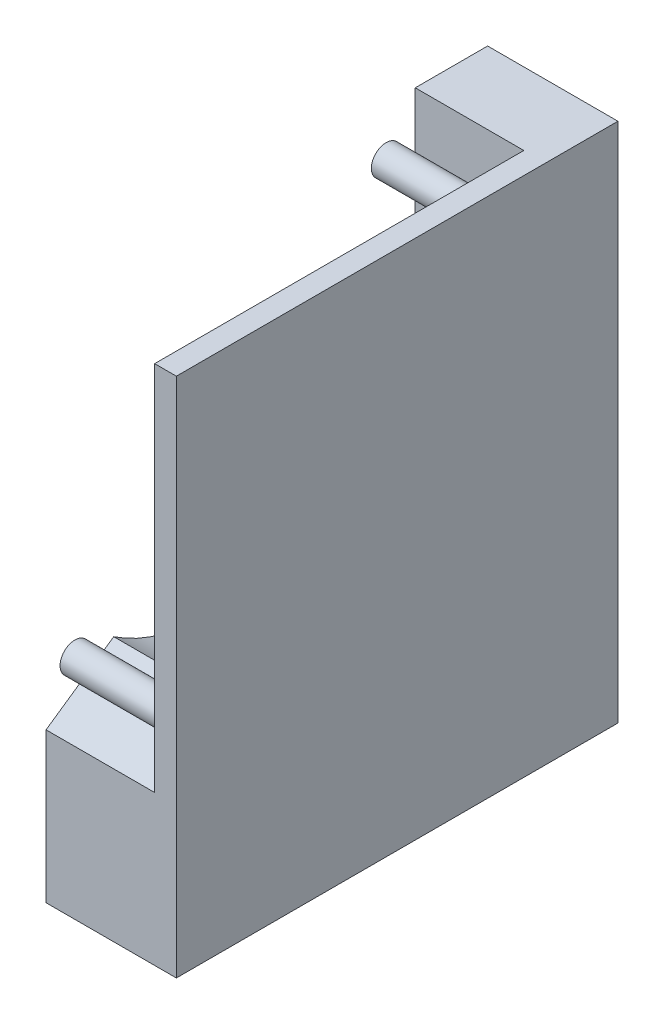
ISO-10303-21;
HEADER;
FILE_DESCRIPTION(('STEP AP214'),'2;1');
FILE_NAME('part.step','',(''),(''),'','','');
FILE_SCHEMA(('AUTOMOTIVE_DESIGN { 1 0 10303 214 1 1 1 1 }'));
ENDSEC;
DATA;
#1=APPLICATION_CONTEXT('core data for automotive mechanical design processes');
#2=APPLICATION_PROTOCOL_DEFINITION('international standard','automotive_design',2000,#1);
#3=PRODUCT_CONTEXT('',#1,'mechanical');
#4=PRODUCT('Part','Part','',(#3));
#5=PRODUCT_RELATED_PRODUCT_CATEGORY('part','',(#4));
#6=PRODUCT_DEFINITION_FORMATION('','',#4);
#7=PRODUCT_DEFINITION_CONTEXT('part definition',#1,'design');
#8=PRODUCT_DEFINITION('design','',#6,#7);
#9=PRODUCT_DEFINITION_SHAPE('','',#8);
#10=(LENGTH_UNIT() NAMED_UNIT(*) SI_UNIT(.MILLI.,.METRE.));
#11=(NAMED_UNIT(*) PLANE_ANGLE_UNIT() SI_UNIT($,.RADIAN.));
#12=(NAMED_UNIT(*) SI_UNIT($,.STERADIAN.) SOLID_ANGLE_UNIT());
#13=UNCERTAINTY_MEASURE_WITH_UNIT(LENGTH_MEASURE(1.E-05),#10,'distance_accuracy_value','');
#14=(GEOMETRIC_REPRESENTATION_CONTEXT(3) GLOBAL_UNCERTAINTY_ASSIGNED_CONTEXT((#13)) GLOBAL_UNIT_ASSIGNED_CONTEXT((#10,
#11,#12)) REPRESENTATION_CONTEXT('',''));
#15=CARTESIAN_POINT('',(0.,0.,0.));
#16=DIRECTION('',(0.,0.,1.));
#17=DIRECTION('',(1.,0.,0.));
#18=AXIS2_PLACEMENT_3D('',#15,#16,#17);
#19=CARTESIAN_POINT('',(-18.,0.,0.));
#20=DIRECTION('',(0.,-1.,0.));
#21=DIRECTION('',(0.,0.,-1.));
#22=AXIS2_PLACEMENT_3D('',#19,#20,#21);
#23=PLANE('',#22);
#24=CARTESIAN_POINT('',(-10.5,0.,6.51810953168023));
#25=DIRECTION('',(0.,-1.,0.));
#26=DIRECTION('',(0.,0.,-1.));
#27=AXIS2_PLACEMENT_3D('',#24,#25,#26);
#28=CIRCLE('',#27,2.94999999999999);
#29=CARTESIAN_POINT('',(-10.5,0.,3.56810953168023));
#30=VERTEX_POINT('',#29);
#31=EDGE_CURVE('E260',#30,#30,#28,.F.);
#32=ORIENTED_EDGE('',*,*,#31,.T.);
#33=EDGE_LOOP('',(#32));
#34=FACE_BOUND('',#33,.T.);
#35=CARTESIAN_POINT('',(-10.5,0.,32.5181095316802));
#36=DIRECTION('',(0.,-1.,0.));
#37=DIRECTION('',(0.,0.,-1.));
#38=AXIS2_PLACEMENT_3D('',#35,#36,#37);
#39=CIRCLE('',#38,2.95000000000003);
#40=CARTESIAN_POINT('',(-10.5,0.,29.5681095316802));
#41=VERTEX_POINT('',#40);
#42=EDGE_CURVE('E257',#41,#41,#39,.F.);
#43=ORIENTED_EDGE('',*,*,#42,.T.);
#44=EDGE_LOOP('',(#43));
#45=FACE_BOUND('',#44,.T.);
#46=DIRECTION('',(0.,0.,-1.));
#47=VECTOR('',#46,1.);
#48=CARTESIAN_POINT('',(-18.,0.,0.));
#49=LINE('',#48,#47);
#50=CARTESIAN_POINT('',(-18.,0.,61.));
#51=VERTEX_POINT('',#50);
#52=CARTESIAN_POINT('',(-18.,0.,28.5181095316802));
#53=VERTEX_POINT('',#52);
#54=EDGE_CURVE('E233',#51,#53,#49,.T.);
#55=ORIENTED_EDGE('',*,*,#54,.T.);
#56=DIRECTION('',(-1.,0.,0.));
#57=VECTOR('',#56,1.);
#58=CARTESIAN_POINT('',(-17.,0.,28.5181095316802));
#59=LINE('',#58,#57);
#60=CARTESIAN_POINT('',(-4.,0.,28.5181095316802));
#61=VERTEX_POINT('',#60);
#62=EDGE_CURVE('E156',#61,#53,#59,.T.);
#63=ORIENTED_EDGE('',*,*,#62,.F.);
#64=DIRECTION('',(0.,0.,1.));
#65=VECTOR('',#64,1.);
#66=CARTESIAN_POINT('',(-4.,0.,28.5181095316802));
#67=LINE('',#66,#65);
#68=CARTESIAN_POINT('',(-4.,0.,10.5181095316802));
#69=VERTEX_POINT('',#68);
#70=EDGE_CURVE('E216',#69,#61,#67,.T.);
#71=ORIENTED_EDGE('',*,*,#70,.F.);
#72=DIRECTION('',(1.,0.,0.));
#73=VECTOR('',#72,1.);
#74=CARTESIAN_POINT('',(-17.,0.,10.5181095316802));
#75=LINE('',#74,#73);
#76=CARTESIAN_POINT('',(-18.,0.,10.5181095316802));
#77=VERTEX_POINT('',#76);
#78=EDGE_CURVE('E211',#77,#69,#75,.T.);
#79=ORIENTED_EDGE('',*,*,#78,.F.);
#80=CARTESIAN_POINT('',(-18.,0.,0.));
#81=VERTEX_POINT('',#80);
#82=EDGE_CURVE('E163',#77,#81,#49,.T.);
#83=ORIENTED_EDGE('',*,*,#82,.T.);
#84=DIRECTION('',(1.,0.,0.));
#85=VECTOR('',#84,1.);
#86=CARTESIAN_POINT('',(-18.,0.,0.));
#87=LINE('',#86,#85);
#88=CARTESIAN_POINT('',(0.,0.,0.));
#89=VERTEX_POINT('',#88);
#90=EDGE_CURVE('E247',#81,#89,#87,.T.);
#91=ORIENTED_EDGE('',*,*,#90,.T.);
#92=DIRECTION('',(0.,0.,-1.));
#93=VECTOR('',#92,1.);
#94=CARTESIAN_POINT('',(0.,0.,0.));
#95=LINE('',#94,#93);
#96=CARTESIAN_POINT('',(0.,0.,61.));
#97=VERTEX_POINT('',#96);
#98=EDGE_CURVE('E228',#97,#89,#95,.T.);
#99=ORIENTED_EDGE('',*,*,#98,.F.);
#100=DIRECTION('',(1.,0.,0.));
#101=VECTOR('',#100,1.);
#102=CARTESIAN_POINT('',(-18.,0.,61.));
#103=LINE('',#102,#101);
#104=EDGE_CURVE('E250',#51,#97,#103,.T.);
#105=ORIENTED_EDGE('',*,*,#104,.F.);
#106=EDGE_LOOP('',(#55,#63,#71,#79,#83,#91,#99,#105));
#107=FACE_BOUND('',#106,.T.);
#108=ADVANCED_FACE('F37',(#34,#45,#107),#23,.T.);
#109=CARTESIAN_POINT('',(-18.,0.,0.));
#110=DIRECTION('',(1.,0.,0.));
#111=DIRECTION('',(0.,0.,-1.));
#112=AXIS2_PLACEMENT_3D('',#109,#110,#111);
#113=PLANE('',#112);
#114=DIRECTION('',(0.,1.,0.));
#115=VECTOR('',#114,1.);
#116=CARTESIAN_POINT('',(-18.,0.,28.5181095316802));
#117=LINE('',#116,#115);
#118=CARTESIAN_POINT('',(-18.,20.,28.5181095316802));
#119=VERTEX_POINT('',#118);
#120=EDGE_CURVE('E165',#53,#119,#117,.T.);
#121=ORIENTED_EDGE('',*,*,#120,.F.);
#122=ORIENTED_EDGE('',*,*,#54,.F.);
#123=DIRECTION('',(0.,-1.,0.));
#124=VECTOR('',#123,1.);
#125=CARTESIAN_POINT('',(-18.,0.,61.));
#126=LINE('',#125,#124);
#127=CARTESIAN_POINT('',(-18.,20.6918016307706,61.));
#128=VERTEX_POINT('',#127);
#129=EDGE_CURVE('E231',#128,#51,#126,.T.);
#130=ORIENTED_EDGE('',*,*,#129,.F.);
#131=DIRECTION('',(0.,-0.568928608917866,0.822386914994871));
#132=VECTOR('',#131,1.);
#133=CARTESIAN_POINT('',(-18.,27.1587797976396,51.6519761168165));
#134=LINE('',#133,#132);
#135=CARTESIAN_POINT('',(-18.,27.1587797976396,51.6519761168165));
#136=VERTEX_POINT('',#135);
#137=EDGE_CURVE('E380',#136,#128,#134,.T.);
#138=ORIENTED_EDGE('',*,*,#137,.F.);
#139=CARTESIAN_POINT('',(-18.,46.0808904616471,38.9645477243318));
#140=DIRECTION('',(-1.,0.,0.));
#141=DIRECTION('',(0.,0.,1.));
#142=AXIS2_PLACEMENT_3D('',#139,#140,#141);
#143=CIRCLE('',#142,22.7819470457504);
#144=CARTESIAN_POINT('',(-18.,24.3517281693415,32.1190662021875));
#145=VERTEX_POINT('',#144);
#146=EDGE_CURVE('E382',#145,#136,#143,.T.);
#147=ORIENTED_EDGE('',*,*,#146,.F.);
#148=CARTESIAN_POINT('',(-18.,22.4441508890792,31.5181095316802));
#149=DIRECTION('',(1.,0.,0.));
#150=DIRECTION('',(0.,0.,-1.));
#151=AXIS2_PLACEMENT_3D('',#148,#149,#150);
#152=CIRCLE('',#151,1.99999999999999);
#153=CARTESIAN_POINT('',(-18.,22.4441508890792,29.5181095316802));
#154=VERTEX_POINT('',#153);
#155=EDGE_CURVE('E172',#154,#145,#152,.T.);
#156=ORIENTED_EDGE('',*,*,#155,.F.);
#157=DIRECTION('',(0.,1.,0.));
#158=VECTOR('',#157,1.);
#159=CARTESIAN_POINT('',(-18.,20.,29.5181095316802));
#160=LINE('',#159,#158);
#161=CARTESIAN_POINT('',(-18.,20.,29.5181095316802));
#162=VERTEX_POINT('',#161);
#163=EDGE_CURVE('E169',#162,#154,#160,.T.);
#164=ORIENTED_EDGE('',*,*,#163,.F.);
#165=DIRECTION('',(0.,0.,1.));
#166=VECTOR('',#165,1.);
#167=CARTESIAN_POINT('',(-18.,20.,9.99999999999996));
#168=LINE('',#167,#166);
#169=EDGE_CURVE('E164',#119,#162,#168,.T.);
#170=ORIENTED_EDGE('',*,*,#169,.F.);
#171=EDGE_LOOP('',(#121,#122,#130,#138,#147,#156,#164,#170));
#172=FACE_BOUND('',#171,.T.);
#173=ADVANCED_FACE('F312',(#172),#113,.F.);
#174=DIRECTION('',(0.,-1.,0.));
#175=VECTOR('',#174,1.);
#176=CARTESIAN_POINT('',(-18.,0.,10.5181095316802));
#177=LINE('',#176,#175);
#178=CARTESIAN_POINT('',(-18.,20.,10.5181095316802));
#179=VERTEX_POINT('',#178);
#180=EDGE_CURVE('E150',#179,#77,#177,.T.);
#181=ORIENTED_EDGE('',*,*,#180,.F.);
#182=CARTESIAN_POINT('',(-18.,20.,9.99999999999996));
#183=VERTEX_POINT('',#182);
#184=EDGE_CURVE('E161',#183,#179,#168,.T.);
#185=ORIENTED_EDGE('',*,*,#184,.F.);
#186=DIRECTION('',(0.,-1.,0.));
#187=VECTOR('',#186,1.);
#188=CARTESIAN_POINT('',(-18.,20.,9.99999999999996));
#189=LINE('',#188,#187);
#190=CARTESIAN_POINT('',(-18.,72.,9.99999999999996));
#191=VERTEX_POINT('',#190);
#192=EDGE_CURVE('E61',#191,#183,#189,.T.);
#193=ORIENTED_EDGE('',*,*,#192,.F.);
#194=DIRECTION('',(0.,0.,1.));
#195=VECTOR('',#194,1.);
#196=CARTESIAN_POINT('',(-18.,72.,0.));
#197=LINE('',#196,#195);
#198=CARTESIAN_POINT('',(-18.,72.,0.));
#199=VERTEX_POINT('',#198);
#200=EDGE_CURVE('E227',#199,#191,#197,.T.);
#201=ORIENTED_EDGE('',*,*,#200,.F.);
#202=DIRECTION('',(0.,1.,0.));
#203=VECTOR('',#202,1.);
#204=CARTESIAN_POINT('',(-18.,0.,0.));
#205=LINE('',#204,#203);
#206=EDGE_CURVE('E224',#81,#199,#205,.T.);
#207=ORIENTED_EDGE('',*,*,#206,.F.);
#208=ORIENTED_EDGE('',*,*,#82,.F.);
#209=EDGE_LOOP('',(#181,#185,#193,#201,#207,#208));
#210=FACE_BOUND('',#209,.T.);
#211=ADVANCED_FACE('F160',(#210),#113,.F.);
#212=CARTESIAN_POINT('',(73.5391052434009,20.,9.99999999999996));
#213=DIRECTION('',(0.,-1.,0.));
#214=DIRECTION('',(0.,0.,-1.));
#215=AXIS2_PLACEMENT_3D('',#212,#213,#214);
#216=PLANE('',#215);
#217=DIRECTION('',(-1.,0.,0.));
#218=VECTOR('',#217,1.);
#219=CARTESIAN_POINT('',(-17.,20.,28.5181095316802));
#220=LINE('',#219,#218);
#221=CARTESIAN_POINT('',(-4.,20.,28.5181095316802));
#222=VERTEX_POINT('',#221);
#223=EDGE_CURVE('E53',#222,#119,#220,.T.);
#224=ORIENTED_EDGE('',*,*,#223,.T.);
#225=ORIENTED_EDGE('',*,*,#169,.T.);
#226=DIRECTION('',(-1.,0.,0.));
#227=VECTOR('',#226,1.);
#228=CARTESIAN_POINT('',(73.5391052434009,20.,29.5181095316802));
#229=LINE('',#228,#227);
#230=CARTESIAN_POINT('',(-3.,20.,29.5181095316802));
#231=VERTEX_POINT('',#230);
#232=EDGE_CURVE('E183',#231,#162,#229,.T.);
#233=ORIENTED_EDGE('',*,*,#232,.F.);
#234=DIRECTION('',(0.,0.,1.));
#235=VECTOR('',#234,1.);
#236=CARTESIAN_POINT('',(-3.,20.,9.99999999999996));
#237=LINE('',#236,#235);
#238=CARTESIAN_POINT('',(-3.,20.,9.99999999999996));
#239=VERTEX_POINT('',#238);
#240=EDGE_CURVE('E180',#239,#231,#237,.T.);
#241=ORIENTED_EDGE('',*,*,#240,.F.);
#242=DIRECTION('',(-1.,0.,0.));
#243=VECTOR('',#242,1.);
#244=CARTESIAN_POINT('',(73.5391052434009,20.,9.99999999999996));
#245=LINE('',#244,#243);
#246=EDGE_CURVE('E168',#239,#183,#245,.T.);
#247=ORIENTED_EDGE('',*,*,#246,.T.);
#248=ORIENTED_EDGE('',*,*,#184,.T.);
#249=DIRECTION('',(1.,0.,0.));
#250=VECTOR('',#249,1.);
#251=CARTESIAN_POINT('',(-17.,20.,10.5181095316802));
#252=LINE('',#251,#250);
#253=CARTESIAN_POINT('',(-4.,20.,10.5181095316802));
#254=VERTEX_POINT('',#253);
#255=EDGE_CURVE('E146',#179,#254,#252,.T.);
#256=ORIENTED_EDGE('',*,*,#255,.T.);
#257=DIRECTION('',(0.,0.,1.));
#258=VECTOR('',#257,1.);
#259=CARTESIAN_POINT('',(-4.,20.,28.5181095316802));
#260=LINE('',#259,#258);
#261=EDGE_CURVE('E155',#254,#222,#260,.T.);
#262=ORIENTED_EDGE('',*,*,#261,.T.);
#263=EDGE_LOOP('',(#224,#225,#233,#241,#247,#248,#256,#262));
#264=FACE_BOUND('',#263,.T.);
#265=ADVANCED_FACE('F167',(#264),#216,.F.);
#266=CARTESIAN_POINT('',(-18.,0.,0.));
#267=DIRECTION('',(0.,0.,-1.));
#268=DIRECTION('',(-1.,0.,0.));
#269=AXIS2_PLACEMENT_3D('',#266,#267,#268);
#270=PLANE('',#269);
#271=DIRECTION('',(0.,1.,0.));
#272=VECTOR('',#271,1.);
#273=CARTESIAN_POINT('',(0.,0.,0.));
#274=LINE('',#273,#272);
#275=CARTESIAN_POINT('',(0.,72.,0.));
#276=VERTEX_POINT('',#275);
#277=EDGE_CURVE('E222',#89,#276,#274,.T.);
#278=ORIENTED_EDGE('',*,*,#277,.F.);
#279=ORIENTED_EDGE('',*,*,#90,.F.);
#280=ORIENTED_EDGE('',*,*,#206,.T.);
#281=DIRECTION('',(1.,0.,0.));
#282=VECTOR('',#281,1.);
#283=CARTESIAN_POINT('',(-18.,72.,0.));
#284=LINE('',#283,#282);
#285=EDGE_CURVE('E236',#199,#276,#284,.T.);
#286=ORIENTED_EDGE('',*,*,#285,.T.);
#287=EDGE_LOOP('',(#278,#279,#280,#286));
#288=FACE_BOUND('',#287,.T.);
#289=ADVANCED_FACE('F296',(#288),#270,.T.);
#290=CARTESIAN_POINT('',(-18.,0.,61.));
#291=DIRECTION('',(0.,0.,1.));
#292=DIRECTION('',(1.,0.,0.));
#293=AXIS2_PLACEMENT_3D('',#290,#291,#292);
#294=PLANE('',#293);
#295=DIRECTION('',(0.,1.,0.));
#296=VECTOR('',#295,1.);
#297=CARTESIAN_POINT('',(-3.,0.,61.));
#298=LINE('',#297,#296);
#299=CARTESIAN_POINT('',(-3.,20.6918016307706,61.));
#300=VERTEX_POINT('',#299);
#301=CARTESIAN_POINT('',(-3.,72.,61.));
#302=VERTEX_POINT('',#301);
#303=EDGE_CURVE('E210',#300,#302,#298,.T.);
#304=ORIENTED_EDGE('',*,*,#303,.F.);
#305=DIRECTION('',(1.,0.,0.));
#306=VECTOR('',#305,1.);
#307=CARTESIAN_POINT('',(-18.,20.6918016307706,61.));
#308=LINE('',#307,#306);
#309=EDGE_CURVE('E208',#128,#300,#308,.T.);
#310=ORIENTED_EDGE('',*,*,#309,.F.);
#311=ORIENTED_EDGE('',*,*,#129,.T.);
#312=ORIENTED_EDGE('',*,*,#104,.T.);
#313=DIRECTION('',(0.,-1.,0.));
#314=VECTOR('',#313,1.);
#315=CARTESIAN_POINT('',(0.,0.,61.));
#316=LINE('',#315,#314);
#317=CARTESIAN_POINT('',(0.,72.,61.));
#318=VERTEX_POINT('',#317);
#319=EDGE_CURVE('E242',#318,#97,#316,.T.);
#320=ORIENTED_EDGE('',*,*,#319,.F.);
#321=DIRECTION('',(1.,0.,0.));
#322=VECTOR('',#321,1.);
#323=CARTESIAN_POINT('',(-18.,72.,61.));
#324=LINE('',#323,#322);
#325=EDGE_CURVE('E252',#302,#318,#324,.T.);
#326=ORIENTED_EDGE('',*,*,#325,.F.);
#327=EDGE_LOOP('',(#304,#310,#311,#312,#320,#326));
#328=FACE_BOUND('',#327,.T.);
#329=ADVANCED_FACE('F287',(#328),#294,.T.);
#330=CARTESIAN_POINT('',(-18.,72.,0.));
#331=DIRECTION('',(0.,1.,0.));
#332=DIRECTION('',(0.,0.,1.));
#333=AXIS2_PLACEMENT_3D('',#330,#331,#332);
#334=PLANE('',#333);
#335=DIRECTION('',(0.,0.,-1.));
#336=VECTOR('',#335,1.);
#337=CARTESIAN_POINT('',(-3.,72.,9.99999999999996));
#338=LINE('',#337,#336);
#339=CARTESIAN_POINT('',(-3.,72.,9.99999999999996));
#340=VERTEX_POINT('',#339);
#341=EDGE_CURVE('E188',#302,#340,#338,.T.);
#342=ORIENTED_EDGE('',*,*,#341,.F.);
#343=ORIENTED_EDGE('',*,*,#325,.T.);
#344=DIRECTION('',(0.,0.,1.));
#345=VECTOR('',#344,1.);
#346=CARTESIAN_POINT('',(0.,72.,0.));
#347=LINE('',#346,#345);
#348=EDGE_CURVE('E239',#276,#318,#347,.T.);
#349=ORIENTED_EDGE('',*,*,#348,.F.);
#350=ORIENTED_EDGE('',*,*,#285,.F.);
#351=ORIENTED_EDGE('',*,*,#200,.T.);
#352=DIRECTION('',(-1.,0.,0.));
#353=VECTOR('',#352,1.);
#354=CARTESIAN_POINT('',(73.5391052434009,72.,9.99999999999996));
#355=LINE('',#354,#353);
#356=EDGE_CURVE('E187',#340,#191,#355,.T.);
#357=ORIENTED_EDGE('',*,*,#356,.F.);
#358=EDGE_LOOP('',(#342,#343,#349,#350,#351,#357));
#359=FACE_BOUND('',#358,.T.);
#360=ADVANCED_FACE('F284',(#359),#334,.T.);
#361=CARTESIAN_POINT('',(0.,0.,0.));
#362=DIRECTION('',(1.,0.,0.));
#363=DIRECTION('',(0.,0.,-1.));
#364=AXIS2_PLACEMENT_3D('',#361,#362,#363);
#365=PLANE('',#364);
#366=ORIENTED_EDGE('',*,*,#277,.T.);
#367=ORIENTED_EDGE('',*,*,#348,.T.);
#368=ORIENTED_EDGE('',*,*,#319,.T.);
#369=ORIENTED_EDGE('',*,*,#98,.T.);
#370=EDGE_LOOP('',(#366,#367,#368,#369));
#371=FACE_BOUND('',#370,.T.);
#372=ADVANCED_FACE('F291',(#371),#365,.T.);
#373=CARTESIAN_POINT('',(-17.,20.,28.5181095316802));
#374=DIRECTION('',(0.,0.,1.));
#375=DIRECTION('',(0.,-1.,0.));
#376=AXIS2_PLACEMENT_3D('',#373,#374,#375);
#377=PLANE('',#376);
#378=ORIENTED_EDGE('',*,*,#62,.T.);
#379=ORIENTED_EDGE('',*,*,#120,.T.);
#380=ORIENTED_EDGE('',*,*,#223,.F.);
#381=DIRECTION('',(0.,-1.,0.));
#382=VECTOR('',#381,1.);
#383=CARTESIAN_POINT('',(-4.,20.,28.5181095316802));
#384=LINE('',#383,#382);
#385=EDGE_CURVE('E220',#222,#61,#384,.T.);
#386=ORIENTED_EDGE('',*,*,#385,.T.);
#387=EDGE_LOOP('',(#378,#379,#380,#386));
#388=FACE_BOUND('',#387,.T.);
#389=ADVANCED_FACE('F304',(#388),#377,.F.);
#390=CARTESIAN_POINT('',(-4.,20.,28.5181095316802));
#391=DIRECTION('',(1.,0.,0.));
#392=DIRECTION('',(0.,0.,-1.));
#393=AXIS2_PLACEMENT_3D('',#390,#391,#392);
#394=PLANE('',#393);
#395=ORIENTED_EDGE('',*,*,#70,.T.);
#396=ORIENTED_EDGE('',*,*,#385,.F.);
#397=ORIENTED_EDGE('',*,*,#261,.F.);
#398=DIRECTION('',(0.,-1.,0.));
#399=VECTOR('',#398,1.);
#400=CARTESIAN_POINT('',(-4.,20.,10.5181095316802));
#401=LINE('',#400,#399);
#402=EDGE_CURVE('E152',#254,#69,#401,.T.);
#403=ORIENTED_EDGE('',*,*,#402,.T.);
#404=EDGE_LOOP('',(#395,#396,#397,#403));
#405=FACE_BOUND('',#404,.T.);
#406=ADVANCED_FACE('F302',(#405),#394,.F.);
#407=CARTESIAN_POINT('',(-17.,20.,10.5181095316802));
#408=DIRECTION('',(0.,0.,-1.));
#409=DIRECTION('',(0.,1.,0.));
#410=AXIS2_PLACEMENT_3D('',#407,#408,#409);
#411=PLANE('',#410);
#412=ORIENTED_EDGE('',*,*,#78,.T.);
#413=ORIENTED_EDGE('',*,*,#402,.F.);
#414=ORIENTED_EDGE('',*,*,#255,.F.);
#415=ORIENTED_EDGE('',*,*,#180,.T.);
#416=EDGE_LOOP('',(#412,#413,#414,#415));
#417=FACE_BOUND('',#416,.T.);
#418=ADVANCED_FACE('F149',(#417),#411,.F.);
#419=CARTESIAN_POINT('',(-3.,0.,0.));
#420=DIRECTION('',(1.,0.,0.));
#421=DIRECTION('',(0.,0.,-1.));
#422=AXIS2_PLACEMENT_3D('',#419,#420,#421);
#423=PLANE('',#422);
#424=CARTESIAN_POINT('',(-3.,27.4,57.0181095316803));
#425=DIRECTION('',(1.,0.,0.));
#426=DIRECTION('',(0.,0.,-1.));
#427=AXIS2_PLACEMENT_3D('',#424,#425,#426);
#428=CIRCLE('',#427,2.04999999999999);
#429=CARTESIAN_POINT('',(-3.,27.4,54.9681095316803));
#430=VERTEX_POINT('',#429);
#431=EDGE_CURVE('E12',#430,#430,#428,.F.);
#432=ORIENTED_EDGE('',*,*,#431,.F.);
#433=EDGE_LOOP('',(#432));
#434=FACE_BOUND('',#433,.T.);
#435=CARTESIAN_POINT('',(-3.,65.4,14.0181095316803));
#436=DIRECTION('',(1.,0.,0.));
#437=DIRECTION('',(0.,0.,-1.));
#438=AXIS2_PLACEMENT_3D('',#435,#436,#437);
#439=CIRCLE('',#438,2.04999999999999);
#440=CARTESIAN_POINT('',(-3.,65.4,11.9681095316803));
#441=VERTEX_POINT('',#440);
#442=EDGE_CURVE('E46',#441,#441,#439,.F.);
#443=ORIENTED_EDGE('',*,*,#442,.F.);
#444=EDGE_LOOP('',(#443));
#445=FACE_BOUND('',#444,.T.);
#446=ORIENTED_EDGE('',*,*,#303,.T.);
#447=ORIENTED_EDGE('',*,*,#341,.T.);
#448=DIRECTION('',(0.,-1.,0.));
#449=VECTOR('',#448,1.);
#450=CARTESIAN_POINT('',(-3.,20.,9.99999999999996));
#451=LINE('',#450,#449);
#452=EDGE_CURVE('E184',#340,#239,#451,.T.);
#453=ORIENTED_EDGE('',*,*,#452,.T.);
#454=ORIENTED_EDGE('',*,*,#240,.T.);
#455=DIRECTION('',(0.,1.,0.));
#456=VECTOR('',#455,1.);
#457=CARTESIAN_POINT('',(-3.,20.,29.5181095316802));
#458=LINE('',#457,#456);
#459=CARTESIAN_POINT('',(-3.,22.4441508890792,29.5181095316802));
#460=VERTEX_POINT('',#459);
#461=EDGE_CURVE('E176',#231,#460,#458,.T.);
#462=ORIENTED_EDGE('',*,*,#461,.T.);
#463=CARTESIAN_POINT('',(-3.,22.4441508890792,31.5181095316802));
#464=DIRECTION('',(1.,0.,0.));
#465=DIRECTION('',(0.,0.,-1.));
#466=AXIS2_PLACEMENT_3D('',#463,#464,#465);
#467=CIRCLE('',#466,1.99999999999999);
#468=CARTESIAN_POINT('',(-3.,24.3517281693415,32.1190662021875));
#469=VERTEX_POINT('',#468);
#470=EDGE_CURVE('E198',#460,#469,#467,.T.);
#471=ORIENTED_EDGE('',*,*,#470,.T.);
#472=CARTESIAN_POINT('',(-3.,46.0808904616471,38.9645477243318));
#473=DIRECTION('',(1.,0.,0.));
#474=DIRECTION('',(0.,0.,-1.));
#475=AXIS2_PLACEMENT_3D('',#472,#473,#474);
#476=CIRCLE('',#475,22.7819470457504);
#477=CARTESIAN_POINT('',(-3.,27.1587797976396,51.6519761168165));
#478=VERTEX_POINT('',#477);
#479=EDGE_CURVE('E194',#469,#478,#476,.F.);
#480=ORIENTED_EDGE('',*,*,#479,.T.);
#481=DIRECTION('',(0.,-0.568928608917866,0.822386914994871));
#482=VECTOR('',#481,1.);
#483=CARTESIAN_POINT('',(-3.,27.1587797976396,51.6519761168165));
#484=LINE('',#483,#482);
#485=EDGE_CURVE('E190',#478,#300,#484,.T.);
#486=ORIENTED_EDGE('',*,*,#485,.T.);
#487=EDGE_LOOP('',(#446,#447,#453,#454,#462,#471,#480,#486));
#488=FACE_BOUND('',#487,.T.);
#489=ADVANCED_FACE('F270',(#434,#445,#488),#423,.F.);
#490=CARTESIAN_POINT('',(73.5391052434009,20.,29.5181095316802));
#491=DIRECTION('',(0.,0.,1.));
#492=DIRECTION('',(1.,0.,0.));
#493=AXIS2_PLACEMENT_3D('',#490,#491,#492);
#494=PLANE('',#493);
#495=ORIENTED_EDGE('',*,*,#232,.T.);
#496=ORIENTED_EDGE('',*,*,#163,.T.);
#497=DIRECTION('',(-1.,0.,0.));
#498=VECTOR('',#497,1.);
#499=CARTESIAN_POINT('',(73.5391052434009,22.4441508890792,29.5181095316802));
#500=LINE('',#499,#498);
#501=EDGE_CURVE('E179',#460,#154,#500,.T.);
#502=ORIENTED_EDGE('',*,*,#501,.F.);
#503=ORIENTED_EDGE('',*,*,#461,.F.);
#504=EDGE_LOOP('',(#495,#496,#502,#503));
#505=FACE_BOUND('',#504,.T.);
#506=ADVANCED_FACE('F273',(#505),#494,.F.);
#507=CARTESIAN_POINT('',(73.5391052434009,22.4441508890792,31.5181095316802));
#508=DIRECTION('',(-1.,0.,0.));
#509=DIRECTION('',(0.,0.,1.));
#510=AXIS2_PLACEMENT_3D('',#507,#508,#509);
#511=CYLINDRICAL_SURFACE('',#510,1.99999999999999);
#512=ORIENTED_EDGE('',*,*,#501,.T.);
#513=ORIENTED_EDGE('',*,*,#155,.T.);
#514=DIRECTION('',(-1.,0.,0.));
#515=VECTOR('',#514,1.);
#516=CARTESIAN_POINT('',(73.5391052434009,24.3517281693415,32.1190662021875));
#517=LINE('',#516,#515);
#518=EDGE_CURVE('E197',#469,#145,#517,.T.);
#519=ORIENTED_EDGE('',*,*,#518,.F.);
#520=ORIENTED_EDGE('',*,*,#470,.F.);
#521=EDGE_LOOP('',(#512,#513,#519,#520));
#522=FACE_BOUND('',#521,.T.);
#523=ADVANCED_FACE('F388',(#522),#511,.T.);
#524=CARTESIAN_POINT('',(73.5391052434009,46.0808904616471,38.9645477243318));
#525=DIRECTION('',(-1.,0.,0.));
#526=DIRECTION('',(0.,0.,1.));
#527=AXIS2_PLACEMENT_3D('',#524,#525,#526);
#528=CYLINDRICAL_SURFACE('',#527,22.7819470457504);
#529=ORIENTED_EDGE('',*,*,#518,.T.);
#530=ORIENTED_EDGE('',*,*,#146,.T.);
#531=DIRECTION('',(-1.,0.,0.));
#532=VECTOR('',#531,1.);
#533=CARTESIAN_POINT('',(73.5391052434009,27.1587797976396,51.6519761168165));
#534=LINE('',#533,#532);
#535=EDGE_CURVE('E193',#478,#136,#534,.T.);
#536=ORIENTED_EDGE('',*,*,#535,.F.);
#537=ORIENTED_EDGE('',*,*,#479,.F.);
#538=EDGE_LOOP('',(#529,#530,#536,#537));
#539=FACE_BOUND('',#538,.T.);
#540=ADVANCED_FACE('F329',(#539),#528,.F.);
#541=CARTESIAN_POINT('',(73.5391052434009,27.1587797976396,51.6519761168165));
#542=DIRECTION('',(0.,-0.822386914994871,-0.568928608917866));
#543=DIRECTION('',(0.,0.568928608917866,-0.822386914994871));
#544=AXIS2_PLACEMENT_3D('',#541,#542,#543);
#545=PLANE('',#544);
#546=ORIENTED_EDGE('',*,*,#309,.T.);
#547=ORIENTED_EDGE('',*,*,#485,.F.);
#548=ORIENTED_EDGE('',*,*,#535,.T.);
#549=ORIENTED_EDGE('',*,*,#137,.T.);
#550=EDGE_LOOP('',(#546,#547,#548,#549));
#551=FACE_BOUND('',#550,.T.);
#552=ADVANCED_FACE('F320',(#551),#545,.F.);
#553=CARTESIAN_POINT('',(73.5391052434009,20.,9.99999999999996));
#554=DIRECTION('',(0.,0.,-1.));
#555=DIRECTION('',(-1.,0.,0.));
#556=AXIS2_PLACEMENT_3D('',#553,#554,#555);
#557=PLANE('',#556);
#558=ORIENTED_EDGE('',*,*,#356,.T.);
#559=ORIENTED_EDGE('',*,*,#192,.T.);
#560=ORIENTED_EDGE('',*,*,#246,.F.);
#561=ORIENTED_EDGE('',*,*,#452,.F.);
#562=EDGE_LOOP('',(#558,#559,#560,#561));
#563=FACE_BOUND('',#562,.T.);
#564=ADVANCED_FACE('F317',(#563),#557,.F.);
#565=CARTESIAN_POINT('',(-10.5,15.,6.51810953168023));
#566=DIRECTION('',(0.,-1.,0.));
#567=DIRECTION('',(0.,0.,-1.));
#568=AXIS2_PLACEMENT_3D('',#565,#566,#567);
#569=CYLINDRICAL_SURFACE('',#568,1.95);
#570=CARTESIAN_POINT('',(-10.5,1.,6.51810953168023));
#571=DIRECTION('',(0.,-1.,0.));
#572=DIRECTION('',(0.,0.,-1.));
#573=AXIS2_PLACEMENT_3D('',#570,#571,#572);
#574=CIRCLE('',#573,1.95);
#575=CARTESIAN_POINT('',(-10.5,1.,4.56810953168023));
#576=VERTEX_POINT('',#575);
#577=EDGE_CURVE('E249',#576,#576,#574,.T.);
#578=ORIENTED_EDGE('',*,*,#577,.T.);
#579=EDGE_LOOP('',(#578));
#580=FACE_BOUND('',#579,.T.);
#581=CARTESIAN_POINT('',(-10.5,15.,6.51810953168023));
#582=DIRECTION('',(0.,-1.,0.));
#583=DIRECTION('',(0.,0.,-1.));
#584=AXIS2_PLACEMENT_3D('',#581,#582,#583);
#585=CIRCLE('',#584,1.95);
#586=CARTESIAN_POINT('',(-10.5,15.,4.56810953168023));
#587=VERTEX_POINT('',#586);
#588=EDGE_CURVE('E369',#587,#587,#585,.T.);
#589=ORIENTED_EDGE('',*,*,#588,.F.);
#590=EDGE_LOOP('',(#589));
#591=FACE_BOUND('',#590,.T.);
#592=ADVANCED_FACE('F319',(#580,#591),#569,.F.);
#593=CARTESIAN_POINT('',(-10.5,15.,6.51810953168023));
#594=DIRECTION('',(0.,-1.,0.));
#595=DIRECTION('',(0.,0.,-1.));
#596=AXIS2_PLACEMENT_3D('',#593,#594,#595);
#597=PLANE('',#596);
#598=ORIENTED_EDGE('',*,*,#588,.T.);
#599=EDGE_LOOP('',(#598));
#600=FACE_BOUND('',#599,.T.);
#601=ADVANCED_FACE('F326',(#600),#597,.T.);
#602=CARTESIAN_POINT('',(-10.5,15.,32.5181095316802));
#603=DIRECTION('',(0.,-1.,0.));
#604=DIRECTION('',(0.,0.,-1.));
#605=AXIS2_PLACEMENT_3D('',#602,#603,#604);
#606=CYLINDRICAL_SURFACE('',#605,1.95);
#607=CARTESIAN_POINT('',(-10.5,1.00000000000001,32.5181095316802));
#608=DIRECTION('',(0.,-1.,0.));
#609=DIRECTION('',(0.,0.,-1.));
#610=AXIS2_PLACEMENT_3D('',#607,#608,#609);
#611=CIRCLE('',#610,1.95);
#612=CARTESIAN_POINT('',(-10.5,1.00000000000001,30.5681095316802));
#613=VERTEX_POINT('',#612);
#614=EDGE_CURVE('E263',#613,#613,#611,.T.);
#615=ORIENTED_EDGE('',*,*,#614,.T.);
#616=EDGE_LOOP('',(#615));
#617=FACE_BOUND('',#616,.T.);
#618=CARTESIAN_POINT('',(-10.5,15.,32.5181095316802));
#619=DIRECTION('',(0.,-1.,0.));
#620=DIRECTION('',(0.,0.,-1.));
#621=AXIS2_PLACEMENT_3D('',#618,#619,#620);
#622=CIRCLE('',#621,1.95);
#623=CARTESIAN_POINT('',(-10.5,15.,30.5681095316802));
#624=VERTEX_POINT('',#623);
#625=EDGE_CURVE('E309',#624,#624,#622,.T.);
#626=ORIENTED_EDGE('',*,*,#625,.F.);
#627=EDGE_LOOP('',(#626));
#628=FACE_BOUND('',#627,.T.);
#629=ADVANCED_FACE('F360',(#617,#628),#606,.F.);
#630=CARTESIAN_POINT('',(-10.5,15.,32.5181095316802));
#631=DIRECTION('',(0.,-1.,0.));
#632=DIRECTION('',(0.,0.,-1.));
#633=AXIS2_PLACEMENT_3D('',#630,#631,#632);
#634=PLANE('',#633);
#635=ORIENTED_EDGE('',*,*,#625,.T.);
#636=EDGE_LOOP('',(#635));
#637=FACE_BOUND('',#636,.T.);
#638=ADVANCED_FACE('F353',(#637),#634,.T.);
#639=CARTESIAN_POINT('',(-10.5,1.,6.51810953168023));
#640=DIRECTION('',(0.,-1.,0.));
#641=DIRECTION('',(0.,0.,-1.));
#642=AXIS2_PLACEMENT_3D('',#639,#640,#641);
#643=CONICAL_SURFACE('',#642,1.95,0.785398163397445);
#644=ORIENTED_EDGE('',*,*,#31,.F.);
#645=EDGE_LOOP('',(#644));
#646=FACE_BOUND('',#645,.T.);
#647=ORIENTED_EDGE('',*,*,#577,.F.);
#648=EDGE_LOOP('',(#647));
#649=FACE_BOUND('',#648,.T.);
#650=ADVANCED_FACE('F349',(#646,#649),#643,.F.);
#651=CARTESIAN_POINT('',(-10.5,1.00000000000001,32.5181095316802));
#652=DIRECTION('',(0.,-1.,0.));
#653=DIRECTION('',(0.,0.,-1.));
#654=AXIS2_PLACEMENT_3D('',#651,#652,#653);
#655=CONICAL_SURFACE('',#654,1.95,0.785398163397452);
#656=ORIENTED_EDGE('',*,*,#42,.F.);
#657=EDGE_LOOP('',(#656));
#658=FACE_BOUND('',#657,.T.);
#659=ORIENTED_EDGE('',*,*,#614,.F.);
#660=EDGE_LOOP('',(#659));
#661=FACE_BOUND('',#660,.T.);
#662=ADVANCED_FACE('F40',(#658,#661),#655,.F.);
#663=CARTESIAN_POINT('',(-23.7982756057297,65.4,14.0181095316803));
#664=DIRECTION('',(1.,0.,0.));
#665=DIRECTION('',(0.,0.,-1.));
#666=AXIS2_PLACEMENT_3D('',#663,#664,#665);
#667=CYLINDRICAL_SURFACE('',#666,2.04999999999999);
#668=CARTESIAN_POINT('',(-18.,65.4,14.0181095316803));
#669=DIRECTION('',(1.,0.,0.));
#670=DIRECTION('',(0.,0.,-1.));
#671=AXIS2_PLACEMENT_3D('',#668,#669,#670);
#672=CIRCLE('',#671,2.04999999999999);
#673=CARTESIAN_POINT('',(-18.,65.4,11.9681095316803));
#674=VERTEX_POINT('',#673);
#675=EDGE_CURVE('E371',#674,#674,#672,.T.);
#676=ORIENTED_EDGE('',*,*,#675,.T.);
#677=EDGE_LOOP('',(#676));
#678=FACE_BOUND('',#677,.T.);
#679=ORIENTED_EDGE('',*,*,#442,.T.);
#680=EDGE_LOOP('',(#679));
#681=FACE_BOUND('',#680,.T.);
#682=ADVANCED_FACE('F268',(#678,#681),#667,.T.);
#683=CARTESIAN_POINT('',(-18.,0.,0.));
#684=DIRECTION('',(1.,0.,0.));
#685=DIRECTION('',(0.,0.,-1.));
#686=AXIS2_PLACEMENT_3D('',#683,#684,#685);
#687=PLANE('',#686);
#688=ORIENTED_EDGE('',*,*,#675,.F.);
#689=EDGE_LOOP('',(#688));
#690=FACE_BOUND('',#689,.T.);
#691=ADVANCED_FACE('F549',(#690),#687,.F.);
#692=CARTESIAN_POINT('',(-23.7982756057297,27.4,57.0181095316803));
#693=DIRECTION('',(1.,0.,0.));
#694=DIRECTION('',(0.,0.,-1.));
#695=AXIS2_PLACEMENT_3D('',#692,#693,#694);
#696=CYLINDRICAL_SURFACE('',#695,2.04999999999999);
#697=CARTESIAN_POINT('',(-18.,27.4,57.0181095316803));
#698=DIRECTION('',(1.,0.,0.));
#699=DIRECTION('',(0.,0.,-1.));
#700=AXIS2_PLACEMENT_3D('',#697,#698,#699);
#701=CIRCLE('',#700,2.04999999999999);
#702=CARTESIAN_POINT('',(-18.,27.4,54.9681095316803));
#703=VERTEX_POINT('',#702);
#704=EDGE_CURVE('E376',#703,#703,#701,.T.);
#705=ORIENTED_EDGE('',*,*,#704,.T.);
#706=EDGE_LOOP('',(#705));
#707=FACE_BOUND('',#706,.T.);
#708=ORIENTED_EDGE('',*,*,#431,.T.);
#709=EDGE_LOOP('',(#708));
#710=FACE_BOUND('',#709,.T.);
#711=ADVANCED_FACE('F558',(#707,#710),#696,.T.);
#712=CARTESIAN_POINT('',(-18.,0.,0.));
#713=DIRECTION('',(1.,0.,0.));
#714=DIRECTION('',(0.,0.,-1.));
#715=AXIS2_PLACEMENT_3D('',#712,#713,#714);
#716=PLANE('',#715);
#717=ORIENTED_EDGE('',*,*,#704,.F.);
#718=EDGE_LOOP('',(#717));
#719=FACE_BOUND('',#718,.T.);
#720=ADVANCED_FACE('F567',(#719),#716,.F.);
#721=CLOSED_SHELL('',(#108,#173,#211,#265,#289,#329,#360,#372,#389,#406,#418,#489,#506,#523,
#540,#552,#564,#592,#601,#629,#638,#650,#662,#682,#691,#711,#720));
#722=MANIFOLD_SOLID_BREP('B2',#721);
#723=ADVANCED_BREP_SHAPE_REPRESENTATION('',(#18,#722),#14);
#724=SHAPE_DEFINITION_REPRESENTATION(#9,#723);
ENDSEC;
END-ISO-10303-21;
